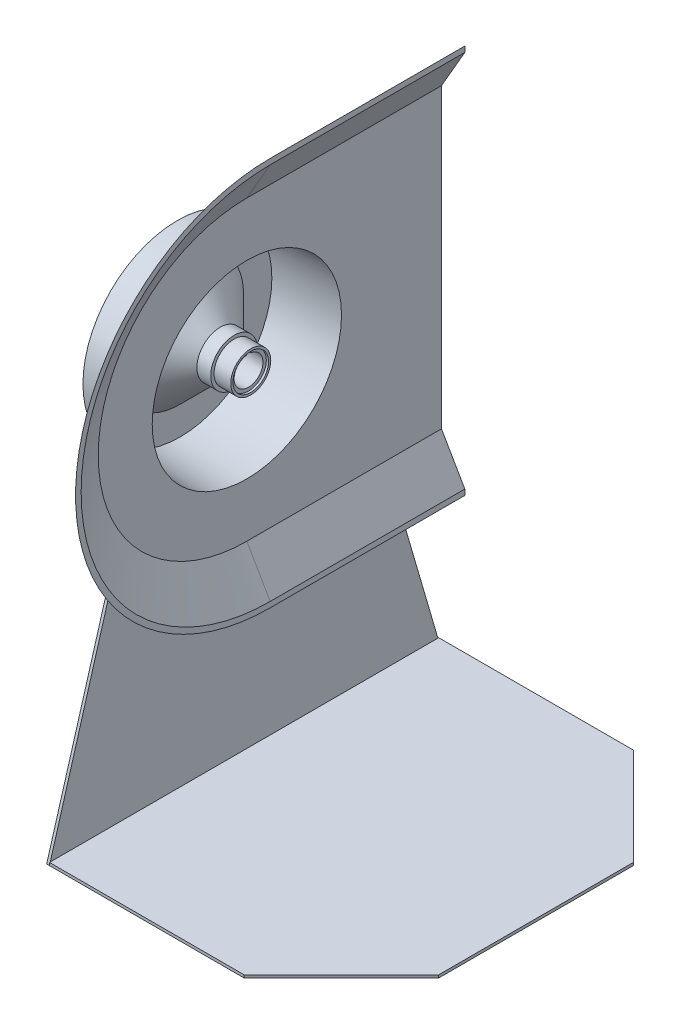
ISO-10303-21;
HEADER;
FILE_DESCRIPTION(('STEP AP214'),'2;1');
FILE_NAME('part.step','',(''),(''),'','','');
FILE_SCHEMA(('AUTOMOTIVE_DESIGN { 1 0 10303 214 1 1 1 1 }'));
ENDSEC;
DATA;
#1=APPLICATION_CONTEXT('core data for automotive mechanical design processes');
#2=APPLICATION_PROTOCOL_DEFINITION('international standard','automotive_design',2000,#1);
#3=PRODUCT_CONTEXT('',#1,'mechanical');
#4=PRODUCT('Part','Part','',(#3));
#5=PRODUCT_RELATED_PRODUCT_CATEGORY('part','',(#4));
#6=PRODUCT_DEFINITION_FORMATION('','',#4);
#7=PRODUCT_DEFINITION_CONTEXT('part definition',#1,'design');
#8=PRODUCT_DEFINITION('design','',#6,#7);
#9=PRODUCT_DEFINITION_SHAPE('','',#8);
#10=(LENGTH_UNIT() NAMED_UNIT(*) SI_UNIT(.MILLI.,.METRE.));
#11=(NAMED_UNIT(*) PLANE_ANGLE_UNIT() SI_UNIT($,.RADIAN.));
#12=(NAMED_UNIT(*) SI_UNIT($,.STERADIAN.) SOLID_ANGLE_UNIT());
#13=UNCERTAINTY_MEASURE_WITH_UNIT(LENGTH_MEASURE(1.E-05),#10,'distance_accuracy_value','');
#14=(GEOMETRIC_REPRESENTATION_CONTEXT(3) GLOBAL_UNCERTAINTY_ASSIGNED_CONTEXT((#13)) GLOBAL_UNIT_ASSIGNED_CONTEXT((#10,
#11,#12)) REPRESENTATION_CONTEXT('',''));
#15=CARTESIAN_POINT('',(0.,0.,0.));
#16=DIRECTION('',(0.,0.,1.));
#17=DIRECTION('',(1.,0.,0.));
#18=AXIS2_PLACEMENT_3D('',#15,#16,#17);
#19=CARTESIAN_POINT('',(-127.,0.,0.));
#20=DIRECTION('',(-1.,0.,0.));
#21=DIRECTION('',(0.,0.,1.));
#22=AXIS2_PLACEMENT_3D('',#19,#20,#21);
#23=PLANE('',#22);
#24=CARTESIAN_POINT('',(-127.,0.,0.));
#25=DIRECTION('',(-1.,0.,0.));
#26=DIRECTION('',(0.,0.,1.));
#27=AXIS2_PLACEMENT_3D('',#24,#25,#26);
#28=CIRCLE('',#27,31.);
#29=CARTESIAN_POINT('',(-127.,0.,31.));
#30=VERTEX_POINT('',#29);
#31=EDGE_CURVE('E293',#30,#30,#28,.T.);
#32=ORIENTED_EDGE('',*,*,#31,.T.);
#33=EDGE_LOOP('',(#32));
#34=FACE_BOUND('',#33,.T.);
#35=DIRECTION('',(0.,0.,1.));
#36=VECTOR('',#35,1.);
#37=CARTESIAN_POINT('',(-127.,30.,-4.00000000000003));
#38=LINE('',#37,#36);
#39=CARTESIAN_POINT('',(-127.,30.,-4.00000000000003));
#40=VERTEX_POINT('',#39);
#41=CARTESIAN_POINT('',(-127.,30.,3.99999999999997));
#42=VERTEX_POINT('',#41);
#43=EDGE_CURVE('E749',#40,#42,#38,.T.);
#44=ORIENTED_EDGE('',*,*,#43,.T.);
#45=DIRECTION('',(0.,-1.,0.));
#46=VECTOR('',#45,1.);
#47=CARTESIAN_POINT('',(-127.,26.,3.99999999999997));
#48=LINE('',#47,#46);
#49=CARTESIAN_POINT('',(-127.,25.6904651573303,3.99999999999997));
#50=VERTEX_POINT('',#49);
#51=EDGE_CURVE('E214',#42,#50,#48,.T.);
#52=ORIENTED_EDGE('',*,*,#51,.T.);
#53=CARTESIAN_POINT('',(-127.,0.,0.));
#54=DIRECTION('',(-1.,0.,0.));
#55=DIRECTION('',(0.,0.,1.));
#56=AXIS2_PLACEMENT_3D('',#53,#54,#55);
#57=CIRCLE('',#56,26.);
#58=CARTESIAN_POINT('',(-127.,25.6904651573303,-3.99999999999999));
#59=VERTEX_POINT('',#58);
#60=EDGE_CURVE('E221',#59,#50,#57,.T.);
#61=ORIENTED_EDGE('',*,*,#60,.F.);
#62=DIRECTION('',(0.,-1.,0.));
#63=VECTOR('',#62,1.);
#64=CARTESIAN_POINT('',(-127.,30.,-4.00000000000003));
#65=LINE('',#64,#63);
#66=EDGE_CURVE('E205',#40,#59,#65,.T.);
#67=ORIENTED_EDGE('',*,*,#66,.F.);
#68=EDGE_LOOP('',(#44,#52,#61,#67));
#69=FACE_BOUND('',#68,.T.);
#70=ADVANCED_FACE('F47',(#34,#69),#23,.T.);
#71=CARTESIAN_POINT('',(0.,0.,0.));
#72=DIRECTION('',(-1.,0.,0.));
#73=DIRECTION('',(0.,0.,1.));
#74=AXIS2_PLACEMENT_3D('',#71,#72,#73);
#75=CYLINDRICAL_SURFACE('',#74,26.);
#76=DIRECTION('',(-1.,0.,0.));
#77=VECTOR('',#76,1.);
#78=CARTESIAN_POINT('',(0.,25.6904651573303,3.99999999999997));
#79=LINE('',#78,#77);
#80=CARTESIAN_POINT('',(-39.,25.6904651573303,3.99999999999997));
#81=VERTEX_POINT('',#80);
#82=EDGE_CURVE('E225',#50,#81,#79,.F.);
#83=ORIENTED_EDGE('',*,*,#82,.T.);
#84=CARTESIAN_POINT('',(-39.,0.,0.));
#85=DIRECTION('',(1.,0.,0.));
#86=DIRECTION('',(0.,0.,-1.));
#87=AXIS2_PLACEMENT_3D('',#84,#85,#86);
#88=CIRCLE('',#87,26.);
#89=CARTESIAN_POINT('',(-39.,25.6904651573303,-3.99999999999999));
#90=VERTEX_POINT('',#89);
#91=EDGE_CURVE('E223',#81,#90,#88,.T.);
#92=ORIENTED_EDGE('',*,*,#91,.T.);
#93=DIRECTION('',(-1.,0.,0.));
#94=VECTOR('',#93,1.);
#95=CARTESIAN_POINT('',(0.,25.6904651573303,-3.99999999999999));
#96=LINE('',#95,#94);
#97=EDGE_CURVE('E208',#59,#90,#96,.F.);
#98=ORIENTED_EDGE('',*,*,#97,.F.);
#99=ORIENTED_EDGE('',*,*,#60,.T.);
#100=EDGE_LOOP('',(#83,#92,#98,#99));
#101=FACE_BOUND('',#100,.T.);
#102=ADVANCED_FACE('F220',(#101),#75,.F.);
#103=CARTESIAN_POINT('',(-39.,32.,0.));
#104=DIRECTION('',(1.,0.,0.));
#105=DIRECTION('',(0.,0.,-1.));
#106=AXIS2_PLACEMENT_3D('',#103,#104,#105);
#107=PLANE('',#106);
#108=CARTESIAN_POINT('',(-39.,0.,0.));
#109=DIRECTION('',(1.,0.,0.));
#110=DIRECTION('',(0.,0.,-1.));
#111=AXIS2_PLACEMENT_3D('',#108,#109,#110);
#112=CIRCLE('',#111,32.);
#113=CARTESIAN_POINT('',(-39.,0.,-32.));
#114=VERTEX_POINT('',#113);
#115=EDGE_CURVE('E431',#114,#114,#112,.T.);
#116=ORIENTED_EDGE('',*,*,#115,.T.);
#117=EDGE_LOOP('',(#116));
#118=FACE_BOUND('',#117,.T.);
#119=ORIENTED_EDGE('',*,*,#91,.F.);
#120=DIRECTION('',(0.,-1.,0.));
#121=VECTOR('',#120,1.);
#122=CARTESIAN_POINT('',(-39.,26.,3.99999999999997));
#123=LINE('',#122,#121);
#124=CARTESIAN_POINT('',(-39.,30.,3.99999999999997));
#125=VERTEX_POINT('',#124);
#126=EDGE_CURVE('E743',#125,#81,#123,.T.);
#127=ORIENTED_EDGE('',*,*,#126,.F.);
#128=DIRECTION('',(0.,0.,1.));
#129=VECTOR('',#128,1.);
#130=CARTESIAN_POINT('',(-39.,30.,-4.00000000000003));
#131=LINE('',#130,#129);
#132=CARTESIAN_POINT('',(-39.,30.,-4.00000000000003));
#133=VERTEX_POINT('',#132);
#134=EDGE_CURVE('E738',#133,#125,#131,.T.);
#135=ORIENTED_EDGE('',*,*,#134,.F.);
#136=DIRECTION('',(0.,-1.,0.));
#137=VECTOR('',#136,1.);
#138=CARTESIAN_POINT('',(-39.,30.,-4.00000000000003));
#139=LINE('',#138,#137);
#140=EDGE_CURVE('E746',#133,#90,#139,.T.);
#141=ORIENTED_EDGE('',*,*,#140,.T.);
#142=EDGE_LOOP('',(#119,#127,#135,#141));
#143=FACE_BOUND('',#142,.T.);
#144=ADVANCED_FACE('F477',(#118,#143),#107,.T.);
#145=CARTESIAN_POINT('',(-47.,-268.593612044262,-1.87557916837002E-12));
#146=DIRECTION('',(1.,0.,0.));
#147=DIRECTION('',(0.,0.,-1.));
#148=AXIS2_PLACEMENT_3D('',#145,#146,#147);
#149=PLANE('',#148);
#150=DIRECTION('',(0.,-0.96,-0.28));
#151=VECTOR('',#150,1.);
#152=CARTESIAN_POINT('',(-47.,0.,-175.));
#153=LINE('',#152,#151);
#154=CARTESIAN_POINT('',(-47.,0.,-175.));
#155=VERTEX_POINT('',#154);
#156=CARTESIAN_POINT('',(-47.,-268.59361204426,-253.339803512909));
#157=VERTEX_POINT('',#156);
#158=EDGE_CURVE('E391',#155,#157,#153,.T.);
#159=ORIENTED_EDGE('',*,*,#158,.F.);
#160=CARTESIAN_POINT('',(-47.,0.,0.));
#161=DIRECTION('',(-1.,0.,0.));
#162=DIRECTION('',(0.,0.,1.));
#163=AXIS2_PLACEMENT_3D('',#160,#161,#162);
#164=CIRCLE('',#163,175.);
#165=CARTESIAN_POINT('',(-47.,0.,175.));
#166=VERTEX_POINT('',#165);
#167=EDGE_CURVE('E11',#166,#155,#164,.T.);
#168=ORIENTED_EDGE('',*,*,#167,.F.);
#169=DIRECTION('',(0.,-0.96,0.28));
#170=VECTOR('',#169,1.);
#171=CARTESIAN_POINT('',(-47.,0.,175.));
#172=LINE('',#171,#170);
#173=CARTESIAN_POINT('',(-47.,-154.144780244417,219.958894237955));
#174=VERTEX_POINT('',#173);
#175=EDGE_CURVE('E370',#166,#174,#172,.T.);
#176=ORIENTED_EDGE('',*,*,#175,.T.);
#177=CARTESIAN_POINT('',(-47.,0.,0.));
#178=DIRECTION('',(-1.,0.,0.));
#179=DIRECTION('',(0.,0.,1.));
#180=AXIS2_PLACEMENT_3D('',#177,#178,#179);
#181=CIRCLE('',#180,268.593612044262);
#182=CARTESIAN_POINT('',(-47.,268.593612044262,1.87557916837002E-12));
#183=VERTEX_POINT('',#182);
#184=EDGE_CURVE('E349',#174,#183,#181,.T.);
#185=ORIENTED_EDGE('',*,*,#184,.T.);
#186=DIRECTION('',(0.,0.,1.));
#187=VECTOR('',#186,1.);
#188=CARTESIAN_POINT('',(-47.,268.593612044264,-349.999999999998));
#189=LINE('',#188,#187);
#190=CARTESIAN_POINT('',(-47.,268.593612044264,-349.999999999998));
#191=VERTEX_POINT('',#190);
#192=EDGE_CURVE('E326',#191,#183,#189,.T.);
#193=ORIENTED_EDGE('',*,*,#192,.F.);
#194=DIRECTION('',(0.,1.,0.));
#195=VECTOR('',#194,1.);
#196=CARTESIAN_POINT('',(-47.,268.593612044264,-349.999999999998));
#197=LINE('',#196,#195);
#198=CARTESIAN_POINT('',(-47.,-268.593612044259,-350.000000000002));
#199=VERTEX_POINT('',#198);
#200=EDGE_CURVE('E316',#199,#191,#197,.T.);
#201=ORIENTED_EDGE('',*,*,#200,.F.);
#202=DIRECTION('',(0.,0.,1.));
#203=VECTOR('',#202,1.);
#204=CARTESIAN_POINT('',(-47.,-268.593612044259,-350.000000000002));
#205=LINE('',#204,#203);
#206=EDGE_CURVE('E331',#199,#157,#205,.T.);
#207=ORIENTED_EDGE('',*,*,#206,.T.);
#208=EDGE_LOOP('',(#159,#168,#176,#185,#193,#201,#207));
#209=FACE_BOUND('',#208,.T.);
#210=ADVANCED_FACE('F365',(#209),#149,.F.);
#211=CARTESIAN_POINT('',(0.,2.44403693719019E-12,-350.));
#212=DIRECTION('',(0.,0.,1.));
#213=DIRECTION('',(0.,-1.,0.));
#214=AXIS2_PLACEMENT_3D('',#211,#212,#213);
#215=PLANE('',#214);
#216=DIRECTION('',(-0.499999999999995,0.866025403784442,0.));
#217=VECTOR('',#216,1.);
#218=CARTESIAN_POINT('',(-147.224318643353,-84.9999999999957,-350.000000000001));
#219=LINE('',#218,#217);
#220=CARTESIAN_POINT('',(0.,-339.999999999997,-350.000000000002));
#221=VERTEX_POINT('',#220);
#222=CARTESIAN_POINT('',(-42.,-267.253866082104,-350.000000000002));
#223=VERTEX_POINT('',#222);
#224=EDGE_CURVE('E238',#221,#223,#219,.T.);
#225=ORIENTED_EDGE('',*,*,#224,.F.);
#226=DIRECTION('',(0.,-1.,0.));
#227=VECTOR('',#226,1.);
#228=CARTESIAN_POINT('',(0.,-349.999999999998,-350.000000000002));
#229=LINE('',#228,#227);
#230=CARTESIAN_POINT('',(0.,-349.999999999998,-350.000000000002));
#231=VERTEX_POINT('',#230);
#232=EDGE_CURVE('E308',#221,#231,#229,.T.);
#233=ORIENTED_EDGE('',*,*,#232,.T.);
#234=DIRECTION('',(-0.499999999999995,0.866025403784442,0.));
#235=VECTOR('',#234,1.);
#236=CARTESIAN_POINT('',(-47.,-268.593612044259,-350.000000000002));
#237=LINE('',#236,#235);
#238=EDGE_CURVE('E313',#231,#199,#237,.T.);
#239=ORIENTED_EDGE('',*,*,#238,.T.);
#240=ORIENTED_EDGE('',*,*,#200,.T.);
#241=DIRECTION('',(0.499999999999995,0.866025403784442,0.));
#242=VECTOR('',#241,1.);
#243=CARTESIAN_POINT('',(0.,350.000000000002,-349.999999999998));
#244=LINE('',#243,#242);
#245=CARTESIAN_POINT('',(0.,350.000000000002,-349.999999999998));
#246=VERTEX_POINT('',#245);
#247=EDGE_CURVE('E319',#191,#246,#244,.T.);
#248=ORIENTED_EDGE('',*,*,#247,.T.);
#249=CARTESIAN_POINT('',(0.,340.000000000002,-349.999999999998));
#250=VERTEX_POINT('',#249);
#251=EDGE_CURVE('E309',#246,#250,#229,.T.);
#252=ORIENTED_EDGE('',*,*,#251,.T.);
#253=DIRECTION('',(0.499999999999995,0.866025403784442,0.));
#254=VECTOR('',#253,1.);
#255=CARTESIAN_POINT('',(-147.224318643353,85.0000000000006,-349.999999999999));
#256=LINE('',#255,#254);
#257=CARTESIAN_POINT('',(-42.,267.253866082108,-349.999999999998));
#258=VERTEX_POINT('',#257);
#259=EDGE_CURVE('E287',#258,#250,#256,.T.);
#260=ORIENTED_EDGE('',*,*,#259,.F.);
#261=DIRECTION('',(0.,1.,0.));
#262=VECTOR('',#261,1.);
#263=CARTESIAN_POINT('',(-42.,2.44403693719019E-12,-350.));
#264=LINE('',#263,#262);
#265=EDGE_CURVE('E283',#223,#258,#264,.T.);
#266=ORIENTED_EDGE('',*,*,#265,.F.);
#267=EDGE_LOOP('',(#225,#233,#239,#240,#248,#252,#260,#266));
#268=FACE_BOUND('',#267,.T.);
#269=ADVANCED_FACE('F386',(#268),#215,.F.);
#270=CARTESIAN_POINT('',(0.,0.,0.));
#271=DIRECTION('',(1.,0.,0.));
#272=DIRECTION('',(0.,0.,-1.));
#273=AXIS2_PLACEMENT_3D('',#270,#271,#272);
#274=CONICAL_SURFACE('',#273,350.,1.0471975511966);
#275=CARTESIAN_POINT('',(0.,0.,0.));
#276=DIRECTION('',(-1.,0.,0.));
#277=DIRECTION('',(0.,0.,1.));
#278=AXIS2_PLACEMENT_3D('',#275,#276,#277);
#279=CIRCLE('',#278,350.);
#280=CARTESIAN_POINT('',(0.,-350.,-2.44403693719019E-12));
#281=VERTEX_POINT('',#280);
#282=CARTESIAN_POINT('',(0.,350.,2.44403693719019E-12));
#283=VERTEX_POINT('',#282);
#284=EDGE_CURVE('E51',#281,#283,#279,.T.);
#285=ORIENTED_EDGE('',*,*,#284,.T.);
#286=DIRECTION('',(-0.499999999999995,-0.866025403784442,0.));
#287=VECTOR('',#286,1.);
#288=CARTESIAN_POINT('',(-47.,268.593612044262,0.));
#289=LINE('',#288,#287);
#290=EDGE_CURVE('E342',#283,#183,#289,.T.);
#291=ORIENTED_EDGE('',*,*,#290,.T.);
#292=ORIENTED_EDGE('',*,*,#184,.F.);
#293=CARTESIAN_POINT('',(-47.,-268.593612044262,-1.83186799063151E-12));
#294=VERTEX_POINT('',#293);
#295=EDGE_CURVE('E350',#294,#174,#181,.T.);
#296=ORIENTED_EDGE('',*,*,#295,.F.);
#297=DIRECTION('',(-0.499999999999995,0.866025403784442,0.));
#298=VECTOR('',#297,1.);
#299=CARTESIAN_POINT('',(-47.,-268.593612044262,-1.87557916837002E-12));
#300=LINE('',#299,#298);
#301=EDGE_CURVE('E346',#281,#294,#300,.T.);
#302=ORIENTED_EDGE('',*,*,#301,.F.);
#303=EDGE_LOOP('',(#285,#291,#292,#296,#302));
#304=FACE_BOUND('',#303,.T.);
#305=ADVANCED_FACE('F375',(#304),#274,.T.);
#306=CARTESIAN_POINT('',(0.,-350.,-2.44403693719019E-12));
#307=DIRECTION('',(-1.,0.,0.));
#308=DIRECTION('',(0.,0.,1.));
#309=AXIS2_PLACEMENT_3D('',#306,#307,#308);
#310=PLANE('',#309);
#311=ORIENTED_EDGE('',*,*,#232,.F.);
#312=DIRECTION('',(0.,0.,1.));
#313=VECTOR('',#312,1.);
#314=CARTESIAN_POINT('',(0.,-339.999999999997,-350.000000000002));
#315=LINE('',#314,#313);
#316=CARTESIAN_POINT('',(0.,-340.,-2.44249065417534E-12));
#317=VERTEX_POINT('',#316);
#318=EDGE_CURVE('E267',#221,#317,#315,.T.);
#319=ORIENTED_EDGE('',*,*,#318,.T.);
#320=CARTESIAN_POINT('',(0.,0.,0.));
#321=DIRECTION('',(-1.,0.,0.));
#322=DIRECTION('',(0.,0.,1.));
#323=AXIS2_PLACEMENT_3D('',#320,#321,#322);
#324=CIRCLE('',#323,340.);
#325=CARTESIAN_POINT('',(0.,340.,0.));
#326=VERTEX_POINT('',#325);
#327=EDGE_CURVE('E255',#317,#326,#324,.T.);
#328=ORIENTED_EDGE('',*,*,#327,.T.);
#329=DIRECTION('',(0.,0.,1.));
#330=VECTOR('',#329,1.);
#331=CARTESIAN_POINT('',(0.,340.,2.37420731041333E-12));
#332=LINE('',#331,#330);
#333=EDGE_CURVE('E271',#250,#326,#332,.T.);
#334=ORIENTED_EDGE('',*,*,#333,.F.);
#335=ORIENTED_EDGE('',*,*,#251,.F.);
#336=DIRECTION('',(0.,0.,1.));
#337=VECTOR('',#336,1.);
#338=CARTESIAN_POINT('',(0.,350.000000000002,-349.999999999998));
#339=LINE('',#338,#337);
#340=EDGE_CURVE('E322',#246,#283,#339,.T.);
#341=ORIENTED_EDGE('',*,*,#340,.T.);
#342=ORIENTED_EDGE('',*,*,#284,.F.);
#343=DIRECTION('',(0.,0.,1.));
#344=VECTOR('',#343,1.);
#345=CARTESIAN_POINT('',(0.,-349.999999999998,-350.000000000002));
#346=LINE('',#345,#344);
#347=EDGE_CURVE('E335',#231,#281,#346,.T.);
#348=ORIENTED_EDGE('',*,*,#347,.F.);
#349=EDGE_LOOP('',(#311,#319,#328,#334,#335,#341,#342,#348));
#350=FACE_BOUND('',#349,.T.);
#351=ADVANCED_FACE('F49',(#350),#310,.F.);
#352=CARTESIAN_POINT('',(-47.,0.,0.));
#353=DIRECTION('',(1.,0.,0.));
#354=DIRECTION('',(0.,0.,1.));
#355=AXIS2_PLACEMENT_3D('',#352,#353,#354);
#356=CONICAL_SURFACE('',#355,175.,0.0436332312998583);
#357=CARTESIAN_POINT('',(-167.,0.,0.));
#358=DIRECTION('',(-1.,0.,0.));
#359=DIRECTION('',(0.,0.,1.));
#360=AXIS2_PLACEMENT_3D('',#357,#358,#359);
#361=CIRCLE('',#360,169.760686850979);
#362=CARTESIAN_POINT('',(-167.,0.,169.760686850979));
#363=VERTEX_POINT('',#362);
#364=EDGE_CURVE('E337',#363,#363,#361,.T.);
#365=ORIENTED_EDGE('',*,*,#364,.F.);
#366=EDGE_LOOP('',(#365));
#367=FACE_BOUND('',#366,.T.);
#368=ORIENTED_EDGE('',*,*,#167,.T.);
#369=CARTESIAN_POINT('',(-47.,0.,0.));
#370=DIRECTION('',(-1.,0.,0.));
#371=DIRECTION('',(0.,0.,1.));
#372=AXIS2_PLACEMENT_3D('',#369,#370,#371);
#373=CIRCLE('',#372,175.);
#374=EDGE_CURVE('E826',#155,#166,#373,.T.);
#375=ORIENTED_EDGE('',*,*,#374,.T.);
#376=EDGE_LOOP('',(#368,#375));
#377=FACE_BOUND('',#376,.T.);
#378=ADVANCED_FACE('F503',(#367,#377),#356,.T.);
#379=CARTESIAN_POINT('',(-167.,0.,0.));
#380=DIRECTION('',(-1.,0.,0.));
#381=DIRECTION('',(0.,0.,1.));
#382=AXIS2_PLACEMENT_3D('',#379,#380,#381);
#383=PLANE('',#382);
#384=CARTESIAN_POINT('',(-167.,0.,0.));
#385=DIRECTION('',(-1.,0.,0.));
#386=DIRECTION('',(0.,0.,1.));
#387=AXIS2_PLACEMENT_3D('',#384,#385,#386);
#388=CIRCLE('',#387,112.);
#389=CARTESIAN_POINT('',(-167.,0.,112.));
#390=VERTEX_POINT('',#389);
#391=EDGE_CURVE('E297',#390,#390,#388,.T.);
#392=ORIENTED_EDGE('',*,*,#391,.F.);
#393=EDGE_LOOP('',(#392));
#394=FACE_BOUND('',#393,.T.);
#395=ORIENTED_EDGE('',*,*,#364,.T.);
#396=EDGE_LOOP('',(#395));
#397=FACE_BOUND('',#396,.T.);
#398=ADVANCED_FACE('F500',(#394,#397),#383,.T.);
#399=CARTESIAN_POINT('',(-47.,-268.593612044259,-350.000000000002));
#400=DIRECTION('',(0.866025403784442,0.499999999999995,0.));
#401=DIRECTION('',(-0.499999999999995,0.866025403784442,0.));
#402=AXIS2_PLACEMENT_3D('',#399,#400,#401);
#403=PLANE('',#402);
#404=ORIENTED_EDGE('',*,*,#301,.T.);
#405=EDGE_CURVE('E330',#157,#294,#205,.T.);
#406=ORIENTED_EDGE('',*,*,#405,.F.);
#407=ORIENTED_EDGE('',*,*,#206,.F.);
#408=ORIENTED_EDGE('',*,*,#238,.F.);
#409=ORIENTED_EDGE('',*,*,#347,.T.);
#410=EDGE_LOOP('',(#404,#406,#407,#408,#409));
#411=FACE_BOUND('',#410,.T.);
#412=ADVANCED_FACE('F497',(#411),#403,.F.);
#413=CARTESIAN_POINT('',(0.,350.000000000002,-349.999999999998));
#414=DIRECTION('',(0.866025403784442,-0.499999999999995,0.));
#415=DIRECTION('',(0.499999999999995,0.866025403784442,0.));
#416=AXIS2_PLACEMENT_3D('',#413,#414,#415);
#417=PLANE('',#416);
#418=ORIENTED_EDGE('',*,*,#290,.F.);
#419=ORIENTED_EDGE('',*,*,#340,.F.);
#420=ORIENTED_EDGE('',*,*,#247,.F.);
#421=ORIENTED_EDGE('',*,*,#192,.T.);
#422=EDGE_LOOP('',(#418,#419,#420,#421));
#423=FACE_BOUND('',#422,.T.);
#424=ADVANCED_FACE('F373',(#423),#417,.F.);
#425=CARTESIAN_POINT('',(-167.,0.,0.));
#426=DIRECTION('',(-1.,0.,0.));
#427=DIRECTION('',(0.,0.,1.));
#428=AXIS2_PLACEMENT_3D('',#425,#426,#427);
#429=CONICAL_SURFACE('',#428,112.,0.78539816339745);
#430=CARTESIAN_POINT('',(-135.,0.,0.));
#431=DIRECTION('',(-1.,0.,0.));
#432=DIRECTION('',(0.,0.,1.));
#433=AXIS2_PLACEMENT_3D('',#430,#431,#432);
#434=CIRCLE('',#433,79.9999999999999);
#435=CARTESIAN_POINT('',(-135.,0.,79.9999999999999));
#436=VERTEX_POINT('',#435);
#437=EDGE_CURVE('E304',#436,#436,#434,.T.);
#438=ORIENTED_EDGE('',*,*,#437,.F.);
#439=EDGE_LOOP('',(#438));
#440=FACE_BOUND('',#439,.T.);
#441=ORIENTED_EDGE('',*,*,#391,.T.);
#442=EDGE_LOOP('',(#441));
#443=FACE_BOUND('',#442,.T.);
#444=ADVANCED_FACE('F488',(#440,#443),#429,.F.);
#445=CARTESIAN_POINT('',(-135.,0.,0.));
#446=DIRECTION('',(-1.,0.,0.));
#447=DIRECTION('',(0.,0.,1.));
#448=AXIS2_PLACEMENT_3D('',#445,#446,#447);
#449=PLANE('',#448);
#450=CARTESIAN_POINT('',(-135.,0.,0.));
#451=DIRECTION('',(-1.,0.,0.));
#452=DIRECTION('',(0.,0.,1.));
#453=AXIS2_PLACEMENT_3D('',#450,#451,#452);
#454=CIRCLE('',#453,31.);
#455=CARTESIAN_POINT('',(-135.,0.,31.));
#456=VERTEX_POINT('',#455);
#457=EDGE_CURVE('E262',#456,#456,#454,.T.);
#458=ORIENTED_EDGE('',*,*,#457,.F.);
#459=EDGE_LOOP('',(#458));
#460=FACE_BOUND('',#459,.T.);
#461=ORIENTED_EDGE('',*,*,#437,.T.);
#462=EDGE_LOOP('',(#461));
#463=FACE_BOUND('',#462,.T.);
#464=ADVANCED_FACE('F484',(#460,#463),#449,.T.);
#465=CARTESIAN_POINT('',(-127.,0.,0.));
#466=DIRECTION('',(-1.,0.,0.));
#467=DIRECTION('',(0.,0.,1.));
#468=AXIS2_PLACEMENT_3D('',#465,#466,#467);
#469=CYLINDRICAL_SURFACE('',#468,31.);
#470=ORIENTED_EDGE('',*,*,#31,.F.);
#471=EDGE_LOOP('',(#470));
#472=FACE_BOUND('',#471,.T.);
#473=ORIENTED_EDGE('',*,*,#457,.T.);
#474=EDGE_LOOP('',(#473));
#475=FACE_BOUND('',#474,.T.);
#476=ADVANCED_FACE('F480',(#472,#475),#469,.F.);
#477=CARTESIAN_POINT('',(4.33012701892221,0.,0.));
#478=DIRECTION('',(1.,0.,0.));
#479=DIRECTION('',(0.,0.,-1.));
#480=AXIS2_PLACEMENT_3D('',#477,#478,#479);
#481=CONICAL_SURFACE('',#480,347.5,1.0471975511966);
#482=ORIENTED_EDGE('',*,*,#327,.F.);
#483=DIRECTION('',(-0.499999999999995,0.866025403784442,0.));
#484=VECTOR('',#483,1.);
#485=CARTESIAN_POINT('',(-42.6698729810789,-266.09361204426,-2.44249065417534E-12));
#486=LINE('',#485,#484);
#487=CARTESIAN_POINT('',(-42.,-267.253866082106,-2.44249065417534E-12));
#488=VERTEX_POINT('',#487);
#489=EDGE_CURVE('E249',#317,#488,#486,.T.);
#490=ORIENTED_EDGE('',*,*,#489,.T.);
#491=CARTESIAN_POINT('',(-42.,0.,0.));
#492=DIRECTION('',(1.,0.,0.));
#493=DIRECTION('',(0.,0.,-1.));
#494=AXIS2_PLACEMENT_3D('',#491,#492,#493);
#495=CIRCLE('',#494,267.253866082106);
#496=CARTESIAN_POINT('',(-42.,267.253866082106,0.));
#497=VERTEX_POINT('',#496);
#498=EDGE_CURVE('E251',#488,#497,#495,.F.);
#499=ORIENTED_EDGE('',*,*,#498,.T.);
#500=DIRECTION('',(0.499999999999995,0.866025403784442,0.));
#501=VECTOR('',#500,1.);
#502=CARTESIAN_POINT('',(4.33012701892221,347.5,0.));
#503=LINE('',#502,#501);
#504=EDGE_CURVE('E245',#326,#497,#503,.F.);
#505=ORIENTED_EDGE('',*,*,#504,.F.);
#506=EDGE_LOOP('',(#482,#490,#499,#505));
#507=FACE_BOUND('',#506,.T.);
#508=ADVANCED_FACE('F483',(#507),#481,.F.);
#509=CARTESIAN_POINT('',(-42.,-268.593612044262,-1.87557916837002E-12));
#510=DIRECTION('',(1.,0.,0.));
#511=DIRECTION('',(0.,0.,-1.));
#512=AXIS2_PLACEMENT_3D('',#509,#510,#511);
#513=PLANE('',#512);
#514=CARTESIAN_POINT('',(-42.,0.,0.));
#515=DIRECTION('',(1.,0.,0.));
#516=DIRECTION('',(0.,0.,-1.));
#517=AXIS2_PLACEMENT_3D('',#514,#515,#516);
#518=CIRCLE('',#517,170.213541288726);
#519=CARTESIAN_POINT('',(-42.,0.,-170.213541288726));
#520=VERTEX_POINT('',#519);
#521=EDGE_CURVE('E258',#520,#520,#518,.F.);
#522=ORIENTED_EDGE('',*,*,#521,.T.);
#523=EDGE_LOOP('',(#522));
#524=FACE_BOUND('',#523,.T.);
#525=DIRECTION('',(0.,0.,1.));
#526=VECTOR('',#525,1.);
#527=CARTESIAN_POINT('',(-42.,-267.253866082106,-1.86622377231871E-12));
#528=LINE('',#527,#526);
#529=EDGE_CURVE('E263',#223,#488,#528,.T.);
#530=ORIENTED_EDGE('',*,*,#529,.F.);
#531=ORIENTED_EDGE('',*,*,#265,.T.);
#532=DIRECTION('',(0.,0.,1.));
#533=VECTOR('',#532,1.);
#534=CARTESIAN_POINT('',(-42.,267.253866082108,-349.999999999998));
#535=LINE('',#534,#533);
#536=EDGE_CURVE('E268',#258,#497,#535,.T.);
#537=ORIENTED_EDGE('',*,*,#536,.T.);
#538=ORIENTED_EDGE('',*,*,#498,.F.);
#539=EDGE_LOOP('',(#530,#531,#537,#538));
#540=FACE_BOUND('',#539,.T.);
#541=ADVANCED_FACE('F1040',(#524,#540),#513,.T.);
#542=CARTESIAN_POINT('',(-46.7819030631733,0.,0.));
#543=DIRECTION('',(1.,0.,0.));
#544=DIRECTION('',(0.,0.,1.));
#545=AXIS2_PLACEMENT_3D('',#542,#543,#544);
#546=CONICAL_SURFACE('',#545,170.004758892091,0.0436332312998583);
#547=CARTESIAN_POINT('',(-162.,0.,0.));
#548=DIRECTION('',(-1.,0.,0.));
#549=DIRECTION('',(0.,0.,1.));
#550=AXIS2_PLACEMENT_3D('',#547,#548,#549);
#551=CIRCLE('',#550,164.974228139705);
#552=CARTESIAN_POINT('',(-162.,0.,164.974228139705));
#553=VERTEX_POINT('',#552);
#554=EDGE_CURVE('E250',#553,#553,#551,.T.);
#555=ORIENTED_EDGE('',*,*,#554,.T.);
#556=EDGE_LOOP('',(#555));
#557=FACE_BOUND('',#556,.T.);
#558=ORIENTED_EDGE('',*,*,#521,.F.);
#559=EDGE_LOOP('',(#558));
#560=FACE_BOUND('',#559,.T.);
#561=ADVANCED_FACE('F1042',(#557,#560),#546,.F.);
#562=CARTESIAN_POINT('',(-162.,0.,0.));
#563=DIRECTION('',(-1.,0.,0.));
#564=DIRECTION('',(0.,0.,1.));
#565=AXIS2_PLACEMENT_3D('',#562,#563,#564);
#566=PLANE('',#565);
#567=CARTESIAN_POINT('',(-162.,0.,0.));
#568=DIRECTION('',(-1.,0.,0.));
#569=DIRECTION('',(0.,0.,1.));
#570=AXIS2_PLACEMENT_3D('',#567,#568,#569);
#571=CIRCLE('',#570,114.071067811865);
#572=CARTESIAN_POINT('',(-162.,0.,114.071067811865));
#573=VERTEX_POINT('',#572);
#574=EDGE_CURVE('E230',#573,#573,#571,.T.);
#575=ORIENTED_EDGE('',*,*,#574,.T.);
#576=EDGE_LOOP('',(#575));
#577=FACE_BOUND('',#576,.T.);
#578=ORIENTED_EDGE('',*,*,#554,.F.);
#579=EDGE_LOOP('',(#578));
#580=FACE_BOUND('',#579,.T.);
#581=ADVANCED_FACE('F1049',(#577,#580),#566,.F.);
#582=CARTESIAN_POINT('',(-42.6698729810778,-266.093612044259,-350.000000000002));
#583=DIRECTION('',(0.866025403784442,0.499999999999995,0.));
#584=DIRECTION('',(-0.499999999999995,0.866025403784442,0.));
#585=AXIS2_PLACEMENT_3D('',#582,#583,#584);
#586=PLANE('',#585);
#587=ORIENTED_EDGE('',*,*,#489,.F.);
#588=ORIENTED_EDGE('',*,*,#318,.F.);
#589=ORIENTED_EDGE('',*,*,#224,.T.);
#590=ORIENTED_EDGE('',*,*,#529,.T.);
#591=EDGE_LOOP('',(#587,#588,#589,#590));
#592=FACE_BOUND('',#591,.T.);
#593=ADVANCED_FACE('F1034',(#592),#586,.T.);
#594=CARTESIAN_POINT('',(4.33012701892221,347.500000000003,-349.999999999998));
#595=DIRECTION('',(0.866025403784442,-0.499999999999995,0.));
#596=DIRECTION('',(0.499999999999995,0.866025403784442,0.));
#597=AXIS2_PLACEMENT_3D('',#594,#595,#596);
#598=PLANE('',#597);
#599=ORIENTED_EDGE('',*,*,#504,.T.);
#600=ORIENTED_EDGE('',*,*,#536,.F.);
#601=ORIENTED_EDGE('',*,*,#259,.T.);
#602=ORIENTED_EDGE('',*,*,#333,.T.);
#603=EDGE_LOOP('',(#599,#600,#601,#602));
#604=FACE_BOUND('',#603,.T.);
#605=ADVANCED_FACE('F466',(#604),#598,.T.);
#606=CARTESIAN_POINT('',(-163.464466094067,0.,0.));
#607=DIRECTION('',(-1.,0.,0.));
#608=DIRECTION('',(0.,0.,1.));
#609=AXIS2_PLACEMENT_3D('',#606,#607,#608);
#610=CONICAL_SURFACE('',#609,115.535533905933,0.78539816339745);
#611=ORIENTED_EDGE('',*,*,#574,.F.);
#612=EDGE_LOOP('',(#611));
#613=FACE_BOUND('',#612,.T.);
#614=CARTESIAN_POINT('',(-89.9289321881346,0.,0.));
#615=DIRECTION('',(1.,0.,0.));
#616=DIRECTION('',(0.,0.,-1.));
#617=AXIS2_PLACEMENT_3D('',#614,#615,#616);
#618=CIRCLE('',#617,42.);
#619=CARTESIAN_POINT('',(-89.9289321881346,0.,-42.));
#620=VERTEX_POINT('',#619);
#621=EDGE_CURVE('E231',#620,#620,#618,.T.);
#622=ORIENTED_EDGE('',*,*,#621,.F.);
#623=EDGE_LOOP('',(#622));
#624=FACE_BOUND('',#623,.T.);
#625=ADVANCED_FACE('F457',(#613,#624),#610,.T.);
#626=CARTESIAN_POINT('',(0.,0.,0.));
#627=DIRECTION('',(1.,0.,0.));
#628=DIRECTION('',(0.,0.,-1.));
#629=AXIS2_PLACEMENT_3D('',#626,#627,#628);
#630=CYLINDRICAL_SURFACE('',#629,42.);
#631=ORIENTED_EDGE('',*,*,#621,.T.);
#632=EDGE_LOOP('',(#631));
#633=FACE_BOUND('',#632,.T.);
#634=CARTESIAN_POINT('',(-65.,0.,0.));
#635=DIRECTION('',(1.,0.,0.));
#636=DIRECTION('',(0.,0.,-1.));
#637=AXIS2_PLACEMENT_3D('',#634,#635,#636);
#638=CIRCLE('',#637,42.);
#639=CARTESIAN_POINT('',(-65.,0.,-42.));
#640=VERTEX_POINT('',#639);
#641=EDGE_CURVE('E241',#640,#640,#638,.T.);
#642=ORIENTED_EDGE('',*,*,#641,.F.);
#643=EDGE_LOOP('',(#642));
#644=FACE_BOUND('',#643,.T.);
#645=ADVANCED_FACE('F455',(#633,#644),#630,.T.);
#646=CARTESIAN_POINT('',(-65.,42.,0.));
#647=DIRECTION('',(1.,0.,0.));
#648=DIRECTION('',(0.,0.,-1.));
#649=AXIS2_PLACEMENT_3D('',#646,#647,#648);
#650=PLANE('',#649);
#651=ORIENTED_EDGE('',*,*,#641,.T.);
#652=EDGE_LOOP('',(#651));
#653=FACE_BOUND('',#652,.T.);
#654=CARTESIAN_POINT('',(-65.,0.,0.));
#655=DIRECTION('',(1.,0.,0.));
#656=DIRECTION('',(0.,0.,-1.));
#657=AXIS2_PLACEMENT_3D('',#654,#655,#656);
#658=CIRCLE('',#657,36.);
#659=CARTESIAN_POINT('',(-65.,0.,-36.));
#660=VERTEX_POINT('',#659);
#661=EDGE_CURVE('E443',#660,#660,#658,.T.);
#662=ORIENTED_EDGE('',*,*,#661,.F.);
#663=EDGE_LOOP('',(#662));
#664=FACE_BOUND('',#663,.T.);
#665=ADVANCED_FACE('F452',(#653,#664),#650,.T.);
#666=CARTESIAN_POINT('',(0.,0.,0.));
#667=DIRECTION('',(1.,0.,0.));
#668=DIRECTION('',(0.,0.,-1.));
#669=AXIS2_PLACEMENT_3D('',#666,#667,#668);
#670=CYLINDRICAL_SURFACE('',#669,36.);
#671=ORIENTED_EDGE('',*,*,#661,.T.);
#672=EDGE_LOOP('',(#671));
#673=FACE_BOUND('',#672,.T.);
#674=CARTESIAN_POINT('',(-35.,0.,0.));
#675=DIRECTION('',(1.,0.,0.));
#676=DIRECTION('',(0.,0.,-1.));
#677=AXIS2_PLACEMENT_3D('',#674,#675,#676);
#678=CIRCLE('',#677,36.);
#679=CARTESIAN_POINT('',(-35.,0.,-36.));
#680=VERTEX_POINT('',#679);
#681=EDGE_CURVE('E439',#680,#680,#678,.T.);
#682=ORIENTED_EDGE('',*,*,#681,.F.);
#683=EDGE_LOOP('',(#682));
#684=FACE_BOUND('',#683,.T.);
#685=ADVANCED_FACE('F464',(#673,#684),#670,.T.);
#686=CARTESIAN_POINT('',(-35.,36.,0.));
#687=DIRECTION('',(1.,0.,0.));
#688=DIRECTION('',(0.,0.,-1.));
#689=AXIS2_PLACEMENT_3D('',#686,#687,#688);
#690=PLANE('',#689);
#691=ORIENTED_EDGE('',*,*,#681,.T.);
#692=EDGE_LOOP('',(#691));
#693=FACE_BOUND('',#692,.T.);
#694=CARTESIAN_POINT('',(-35.,0.,0.));
#695=DIRECTION('',(1.,0.,0.));
#696=DIRECTION('',(0.,0.,-1.));
#697=AXIS2_PLACEMENT_3D('',#694,#695,#696);
#698=CIRCLE('',#697,32.);
#699=CARTESIAN_POINT('',(-35.,0.,-32.));
#700=VERTEX_POINT('',#699);
#701=EDGE_CURVE('E435',#700,#700,#698,.T.);
#702=ORIENTED_EDGE('',*,*,#701,.F.);
#703=EDGE_LOOP('',(#702));
#704=FACE_BOUND('',#703,.T.);
#705=ADVANCED_FACE('F526',(#693,#704),#690,.T.);
#706=CARTESIAN_POINT('',(0.,0.,0.));
#707=DIRECTION('',(1.,0.,0.));
#708=DIRECTION('',(0.,0.,-1.));
#709=AXIS2_PLACEMENT_3D('',#706,#707,#708);
#710=CYLINDRICAL_SURFACE('',#709,32.);
#711=ORIENTED_EDGE('',*,*,#701,.T.);
#712=EDGE_LOOP('',(#711));
#713=FACE_BOUND('',#712,.T.);
#714=ORIENTED_EDGE('',*,*,#115,.F.);
#715=EDGE_LOOP('',(#714));
#716=FACE_BOUND('',#715,.T.);
#717=ADVANCED_FACE('F524',(#713,#716),#710,.F.);
#718=CARTESIAN_POINT('',(-47.,0.,0.));
#719=DIRECTION('',(-1.,0.,0.));
#720=DIRECTION('',(0.,0.,1.));
#721=AXIS2_PLACEMENT_3D('',#718,#719,#720);
#722=PLANE('',#721);
#723=CARTESIAN_POINT('',(-47.,-595.,348.541666666666));
#724=VERTEX_POINT('',#723);
#725=EDGE_CURVE('E842',#174,#724,#172,.T.);
#726=ORIENTED_EDGE('',*,*,#725,.T.);
#727=DIRECTION('',(0.,0.,-1.));
#728=VECTOR('',#727,1.);
#729=CARTESIAN_POINT('',(-47.,-595.,350.));
#730=LINE('',#729,#728);
#731=CARTESIAN_POINT('',(-47.,-595.,-348.541666666667));
#732=VERTEX_POINT('',#731);
#733=EDGE_CURVE('E72',#724,#732,#730,.T.);
#734=ORIENTED_EDGE('',*,*,#733,.T.);
#735=EDGE_CURVE('E393',#157,#732,#153,.T.);
#736=ORIENTED_EDGE('',*,*,#735,.F.);
#737=ORIENTED_EDGE('',*,*,#405,.T.);
#738=ORIENTED_EDGE('',*,*,#295,.T.);
#739=EDGE_LOOP('',(#726,#734,#736,#737,#738));
#740=FACE_BOUND('',#739,.T.);
#741=ADVANCED_FACE('F394',(#740),#722,.F.);
#742=CARTESIAN_POINT('',(-52.,0.,0.));
#743=DIRECTION('',(1.,0.,0.));
#744=DIRECTION('',(0.,0.,-1.));
#745=AXIS2_PLACEMENT_3D('',#742,#743,#744);
#746=CYLINDRICAL_SURFACE('',#745,175.);
#747=ORIENTED_EDGE('',*,*,#374,.F.);
#748=DIRECTION('',(1.,0.,0.));
#749=VECTOR('',#748,1.);
#750=CARTESIAN_POINT('',(-52.,0.,-175.));
#751=LINE('',#750,#749);
#752=CARTESIAN_POINT('',(-52.,0.,-175.));
#753=VERTEX_POINT('',#752);
#754=EDGE_CURVE('E402',#753,#155,#751,.T.);
#755=ORIENTED_EDGE('',*,*,#754,.F.);
#756=CARTESIAN_POINT('',(-52.,0.,0.));
#757=DIRECTION('',(-1.,0.,0.));
#758=DIRECTION('',(0.,0.,1.));
#759=AXIS2_PLACEMENT_3D('',#756,#757,#758);
#760=CIRCLE('',#759,175.);
#761=CARTESIAN_POINT('',(-52.,0.,175.));
#762=VERTEX_POINT('',#761);
#763=EDGE_CURVE('E405',#753,#762,#760,.T.);
#764=ORIENTED_EDGE('',*,*,#763,.T.);
#765=DIRECTION('',(1.,0.,0.));
#766=VECTOR('',#765,1.);
#767=CARTESIAN_POINT('',(-52.,0.,175.));
#768=LINE('',#767,#766);
#769=EDGE_CURVE('E424',#762,#166,#768,.T.);
#770=ORIENTED_EDGE('',*,*,#769,.T.);
#771=EDGE_LOOP('',(#747,#755,#764,#770));
#772=FACE_BOUND('',#771,.T.);
#773=ADVANCED_FACE('F522',(#772),#746,.F.);
#774=CARTESIAN_POINT('',(-52.,0.,-175.));
#775=DIRECTION('',(0.,-0.28,0.96));
#776=DIRECTION('',(0.,-0.96,-0.28));
#777=AXIS2_PLACEMENT_3D('',#774,#775,#776);
#778=PLANE('',#777);
#779=ORIENTED_EDGE('',*,*,#158,.T.);
#780=ORIENTED_EDGE('',*,*,#735,.T.);
#781=DIRECTION('',(0.,-0.96,-0.28));
#782=VECTOR('',#781,1.);
#783=CARTESIAN_POINT('',(-47.,0.,-175.));
#784=LINE('',#783,#782);
#785=CARTESIAN_POINT('',(-47.,-600.,-350.));
#786=VERTEX_POINT('',#785);
#787=EDGE_CURVE('E805',#732,#786,#784,.T.);
#788=ORIENTED_EDGE('',*,*,#787,.T.);
#789=DIRECTION('',(1.,0.,0.));
#790=VECTOR('',#789,1.);
#791=CARTESIAN_POINT('',(-52.,-600.,-350.));
#792=LINE('',#791,#790);
#793=CARTESIAN_POINT('',(-52.,-600.,-350.));
#794=VERTEX_POINT('',#793);
#795=EDGE_CURVE('E417',#794,#786,#792,.T.);
#796=ORIENTED_EDGE('',*,*,#795,.F.);
#797=DIRECTION('',(0.,-0.96,-0.28));
#798=VECTOR('',#797,1.);
#799=CARTESIAN_POINT('',(-52.,0.,-175.));
#800=LINE('',#799,#798);
#801=EDGE_CURVE('E428',#753,#794,#800,.T.);
#802=ORIENTED_EDGE('',*,*,#801,.F.);
#803=ORIENTED_EDGE('',*,*,#754,.T.);
#804=EDGE_LOOP('',(#779,#780,#788,#796,#802,#803));
#805=FACE_BOUND('',#804,.T.);
#806=ADVANCED_FACE('F400',(#805),#778,.F.);
#807=CARTESIAN_POINT('',(-52.,-600.,-350.));
#808=DIRECTION('',(0.,1.,0.));
#809=DIRECTION('',(0.,0.,1.));
#810=AXIS2_PLACEMENT_3D('',#807,#808,#809);
#811=PLANE('',#810);
#812=ORIENTED_EDGE('',*,*,#795,.T.);
#813=DIRECTION('',(-1.,0.,0.));
#814=VECTOR('',#813,1.);
#815=CARTESIAN_POINT('',(303.,-600.,-350.));
#816=LINE('',#815,#814);
#817=CARTESIAN_POINT('',(303.,-600.,-350.));
#818=VERTEX_POINT('',#817);
#819=EDGE_CURVE('E763',#818,#786,#816,.T.);
#820=ORIENTED_EDGE('',*,*,#819,.F.);
#821=DIRECTION('',(-0.707106781186546,0.,-0.707106781186549));
#822=VECTOR('',#821,1.);
#823=CARTESIAN_POINT('',(477.999999999999,-600.,-175.));
#824=LINE('',#823,#822);
#825=CARTESIAN_POINT('',(477.999999999999,-600.,-175.));
#826=VERTEX_POINT('',#825);
#827=EDGE_CURVE('E789',#826,#818,#824,.T.);
#828=ORIENTED_EDGE('',*,*,#827,.F.);
#829=DIRECTION('',(0.,0.,-1.));
#830=VECTOR('',#829,1.);
#831=CARTESIAN_POINT('',(477.999999999999,-600.,175.));
#832=LINE('',#831,#830);
#833=CARTESIAN_POINT('',(477.999999999999,-600.,175.));
#834=VERTEX_POINT('',#833);
#835=EDGE_CURVE('E792',#834,#826,#832,.T.);
#836=ORIENTED_EDGE('',*,*,#835,.F.);
#837=DIRECTION('',(0.707106781186546,0.,-0.707106781186549));
#838=VECTOR('',#837,1.);
#839=CARTESIAN_POINT('',(303.,-600.,350.));
#840=LINE('',#839,#838);
#841=CARTESIAN_POINT('',(303.,-600.,350.));
#842=VERTEX_POINT('',#841);
#843=EDGE_CURVE('E795',#842,#834,#840,.T.);
#844=ORIENTED_EDGE('',*,*,#843,.F.);
#845=DIRECTION('',(1.,0.,0.));
#846=VECTOR('',#845,1.);
#847=CARTESIAN_POINT('',(-47.,-600.,350.));
#848=LINE('',#847,#846);
#849=CARTESIAN_POINT('',(-47.,-600.,350.));
#850=VERTEX_POINT('',#849);
#851=EDGE_CURVE('E798',#850,#842,#848,.T.);
#852=ORIENTED_EDGE('',*,*,#851,.F.);
#853=DIRECTION('',(1.,0.,0.));
#854=VECTOR('',#853,1.);
#855=CARTESIAN_POINT('',(-52.,-600.,350.));
#856=LINE('',#855,#854);
#857=CARTESIAN_POINT('',(-52.,-600.,350.));
#858=VERTEX_POINT('',#857);
#859=EDGE_CURVE('E421',#858,#850,#856,.T.);
#860=ORIENTED_EDGE('',*,*,#859,.F.);
#861=DIRECTION('',(0.,0.,1.));
#862=VECTOR('',#861,1.);
#863=CARTESIAN_POINT('',(-52.,-600.,-350.));
#864=LINE('',#863,#862);
#865=EDGE_CURVE('E831',#794,#858,#864,.T.);
#866=ORIENTED_EDGE('',*,*,#865,.F.);
#867=EDGE_LOOP('',(#812,#820,#828,#836,#844,#852,#860,#866));
#868=FACE_BOUND('',#867,.T.);
#869=ADVANCED_FACE('F588',(#868),#811,.F.);
#870=CARTESIAN_POINT('',(-52.,0.,175.));
#871=DIRECTION('',(0.,0.28,0.96));
#872=DIRECTION('',(0.,-0.96,0.28));
#873=AXIS2_PLACEMENT_3D('',#870,#871,#872);
#874=PLANE('',#873);
#875=ORIENTED_EDGE('',*,*,#175,.F.);
#876=ORIENTED_EDGE('',*,*,#769,.F.);
#877=DIRECTION('',(0.,-0.96,0.28));
#878=VECTOR('',#877,1.);
#879=CARTESIAN_POINT('',(-52.,0.,175.));
#880=LINE('',#879,#878);
#881=EDGE_CURVE('E410',#762,#858,#880,.T.);
#882=ORIENTED_EDGE('',*,*,#881,.T.);
#883=ORIENTED_EDGE('',*,*,#859,.T.);
#884=EDGE_CURVE('E836',#724,#850,#172,.T.);
#885=ORIENTED_EDGE('',*,*,#884,.F.);
#886=ORIENTED_EDGE('',*,*,#725,.F.);
#887=EDGE_LOOP('',(#875,#876,#882,#883,#885,#886));
#888=FACE_BOUND('',#887,.T.);
#889=ADVANCED_FACE('F598',(#888),#874,.T.);
#890=CARTESIAN_POINT('',(-52.,0.,0.));
#891=DIRECTION('',(-1.,0.,0.));
#892=DIRECTION('',(0.,0.,1.));
#893=AXIS2_PLACEMENT_3D('',#890,#891,#892);
#894=PLANE('',#893);
#895=ORIENTED_EDGE('',*,*,#763,.F.);
#896=ORIENTED_EDGE('',*,*,#801,.T.);
#897=ORIENTED_EDGE('',*,*,#865,.T.);
#898=ORIENTED_EDGE('',*,*,#881,.F.);
#899=EDGE_LOOP('',(#895,#896,#897,#898));
#900=FACE_BOUND('',#899,.T.);
#901=ADVANCED_FACE('F610',(#900),#894,.T.);
#902=CARTESIAN_POINT('',(-47.,-595.,350.));
#903=DIRECTION('',(-1.,0.,0.));
#904=DIRECTION('',(0.,0.,1.));
#905=AXIS2_PLACEMENT_3D('',#902,#903,#904);
#906=PLANE('',#905);
#907=ORIENTED_EDGE('',*,*,#787,.F.);
#908=CARTESIAN_POINT('',(-46.9999999999999,-595.,-350.));
#909=VERTEX_POINT('',#908);
#910=EDGE_CURVE('E769',#732,#909,#730,.T.);
#911=ORIENTED_EDGE('',*,*,#910,.T.);
#912=DIRECTION('',(0.,-1.,0.));
#913=VECTOR('',#912,1.);
#914=CARTESIAN_POINT('',(-46.9999999999999,-595.,-350.));
#915=LINE('',#914,#913);
#916=EDGE_CURVE('E785',#909,#786,#915,.T.);
#917=ORIENTED_EDGE('',*,*,#916,.T.);
#918=EDGE_LOOP('',(#907,#911,#917));
#919=FACE_BOUND('',#918,.T.);
#920=ADVANCED_FACE('F618',(#919),#906,.T.);
#921=CARTESIAN_POINT('',(-47.,-595.,350.));
#922=VERTEX_POINT('',#921);
#923=EDGE_CURVE('E764',#922,#724,#730,.T.);
#924=ORIENTED_EDGE('',*,*,#923,.T.);
#925=ORIENTED_EDGE('',*,*,#884,.T.);
#926=DIRECTION('',(0.,-1.,0.));
#927=VECTOR('',#926,1.);
#928=CARTESIAN_POINT('',(-47.,-595.,350.));
#929=LINE('',#928,#927);
#930=EDGE_CURVE('E801',#922,#850,#929,.T.);
#931=ORIENTED_EDGE('',*,*,#930,.F.);
#932=EDGE_LOOP('',(#924,#925,#931));
#933=FACE_BOUND('',#932,.T.);
#934=ADVANCED_FACE('F626',(#933),#906,.T.);
#935=CARTESIAN_POINT('',(-47.,-595.,350.));
#936=DIRECTION('',(0.,0.,-1.));
#937=DIRECTION('',(-1.,0.,0.));
#938=AXIS2_PLACEMENT_3D('',#935,#936,#937);
#939=PLANE('',#938);
#940=ORIENTED_EDGE('',*,*,#851,.T.);
#941=DIRECTION('',(0.,-1.,0.));
#942=VECTOR('',#941,1.);
#943=CARTESIAN_POINT('',(303.,-595.,350.));
#944=LINE('',#943,#942);
#945=CARTESIAN_POINT('',(303.,-595.,350.));
#946=VERTEX_POINT('',#945);
#947=EDGE_CURVE('E806',#946,#842,#944,.T.);
#948=ORIENTED_EDGE('',*,*,#947,.F.);
#949=DIRECTION('',(1.,0.,0.));
#950=VECTOR('',#949,1.);
#951=CARTESIAN_POINT('',(-47.,-595.,350.));
#952=LINE('',#951,#950);
#953=EDGE_CURVE('E782',#922,#946,#952,.T.);
#954=ORIENTED_EDGE('',*,*,#953,.F.);
#955=ORIENTED_EDGE('',*,*,#930,.T.);
#956=EDGE_LOOP('',(#940,#948,#954,#955));
#957=FACE_BOUND('',#956,.T.);
#958=ADVANCED_FACE('F635',(#957),#939,.F.);
#959=CARTESIAN_POINT('',(303.,-595.,350.));
#960=DIRECTION('',(-0.707106781186549,0.,-0.707106781186546));
#961=DIRECTION('',(-0.707106781186546,0.,0.707106781186549));
#962=AXIS2_PLACEMENT_3D('',#959,#960,#961);
#963=PLANE('',#962);
#964=ORIENTED_EDGE('',*,*,#843,.T.);
#965=DIRECTION('',(0.,-1.,0.));
#966=VECTOR('',#965,1.);
#967=CARTESIAN_POINT('',(477.999999999999,-595.,175.));
#968=LINE('',#967,#966);
#969=CARTESIAN_POINT('',(477.999999999999,-595.,175.));
#970=VERTEX_POINT('',#969);
#971=EDGE_CURVE('E810',#970,#834,#968,.T.);
#972=ORIENTED_EDGE('',*,*,#971,.F.);
#973=DIRECTION('',(0.707106781186546,0.,-0.707106781186549));
#974=VECTOR('',#973,1.);
#975=CARTESIAN_POINT('',(303.,-595.,350.));
#976=LINE('',#975,#974);
#977=EDGE_CURVE('E779',#946,#970,#976,.T.);
#978=ORIENTED_EDGE('',*,*,#977,.F.);
#979=ORIENTED_EDGE('',*,*,#947,.T.);
#980=EDGE_LOOP('',(#964,#972,#978,#979));
#981=FACE_BOUND('',#980,.T.);
#982=ADVANCED_FACE('F643',(#981),#963,.F.);
#983=CARTESIAN_POINT('',(477.999999999999,-595.,175.));
#984=DIRECTION('',(-1.,0.,0.));
#985=DIRECTION('',(0.,0.,1.));
#986=AXIS2_PLACEMENT_3D('',#983,#984,#985);
#987=PLANE('',#986);
#988=ORIENTED_EDGE('',*,*,#835,.T.);
#989=DIRECTION('',(0.,-1.,0.));
#990=VECTOR('',#989,1.);
#991=CARTESIAN_POINT('',(477.999999999999,-595.,-175.));
#992=LINE('',#991,#990);
#993=CARTESIAN_POINT('',(477.999999999999,-595.,-175.));
#994=VERTEX_POINT('',#993);
#995=EDGE_CURVE('E814',#994,#826,#992,.T.);
#996=ORIENTED_EDGE('',*,*,#995,.F.);
#997=DIRECTION('',(0.,0.,-1.));
#998=VECTOR('',#997,1.);
#999=CARTESIAN_POINT('',(477.999999999999,-595.,175.));
#1000=LINE('',#999,#998);
#1001=EDGE_CURVE('E776',#970,#994,#1000,.T.);
#1002=ORIENTED_EDGE('',*,*,#1001,.F.);
#1003=ORIENTED_EDGE('',*,*,#971,.T.);
#1004=EDGE_LOOP('',(#988,#996,#1002,#1003));
#1005=FACE_BOUND('',#1004,.T.);
#1006=ADVANCED_FACE('F652',(#1005),#987,.F.);
#1007=CARTESIAN_POINT('',(477.999999999999,-595.,-175.));
#1008=DIRECTION('',(-0.707106781186549,0.,0.707106781186546));
#1009=DIRECTION('',(0.707106781186546,0.,0.707106781186549));
#1010=AXIS2_PLACEMENT_3D('',#1007,#1008,#1009);
#1011=PLANE('',#1010);
#1012=ORIENTED_EDGE('',*,*,#827,.T.);
#1013=DIRECTION('',(0.,-1.,0.));
#1014=VECTOR('',#1013,1.);
#1015=CARTESIAN_POINT('',(303.,-595.,-350.));
#1016=LINE('',#1015,#1014);
#1017=CARTESIAN_POINT('',(303.,-595.,-350.));
#1018=VERTEX_POINT('',#1017);
#1019=EDGE_CURVE('E818',#1018,#818,#1016,.T.);
#1020=ORIENTED_EDGE('',*,*,#1019,.F.);
#1021=DIRECTION('',(-0.707106781186546,0.,-0.707106781186549));
#1022=VECTOR('',#1021,1.);
#1023=CARTESIAN_POINT('',(477.999999999999,-595.,-175.));
#1024=LINE('',#1023,#1022);
#1025=EDGE_CURVE('E773',#994,#1018,#1024,.T.);
#1026=ORIENTED_EDGE('',*,*,#1025,.F.);
#1027=ORIENTED_EDGE('',*,*,#995,.T.);
#1028=EDGE_LOOP('',(#1012,#1020,#1026,#1027));
#1029=FACE_BOUND('',#1028,.T.);
#1030=ADVANCED_FACE('F661',(#1029),#1011,.F.);
#1031=CARTESIAN_POINT('',(303.,-595.,-350.));
#1032=DIRECTION('',(0.,0.,1.));
#1033=DIRECTION('',(1.,0.,0.));
#1034=AXIS2_PLACEMENT_3D('',#1031,#1032,#1033);
#1035=PLANE('',#1034);
#1036=ORIENTED_EDGE('',*,*,#819,.T.);
#1037=ORIENTED_EDGE('',*,*,#916,.F.);
#1038=DIRECTION('',(-1.,0.,0.));
#1039=VECTOR('',#1038,1.);
#1040=CARTESIAN_POINT('',(303.,-595.,-350.));
#1041=LINE('',#1040,#1039);
#1042=EDGE_CURVE('E768',#1018,#909,#1041,.T.);
#1043=ORIENTED_EDGE('',*,*,#1042,.F.);
#1044=ORIENTED_EDGE('',*,*,#1019,.T.);
#1045=EDGE_LOOP('',(#1036,#1037,#1043,#1044));
#1046=FACE_BOUND('',#1045,.T.);
#1047=ADVANCED_FACE('F670',(#1046),#1035,.F.);
#1048=CARTESIAN_POINT('',(0.,-595.,0.));
#1049=DIRECTION('',(0.,1.,0.));
#1050=DIRECTION('',(0.,0.,1.));
#1051=AXIS2_PLACEMENT_3D('',#1048,#1049,#1050);
#1052=PLANE('',#1051);
#1053=ORIENTED_EDGE('',*,*,#923,.F.);
#1054=ORIENTED_EDGE('',*,*,#953,.T.);
#1055=ORIENTED_EDGE('',*,*,#977,.T.);
#1056=ORIENTED_EDGE('',*,*,#1001,.T.);
#1057=ORIENTED_EDGE('',*,*,#1025,.T.);
#1058=ORIENTED_EDGE('',*,*,#1042,.T.);
#1059=ORIENTED_EDGE('',*,*,#910,.F.);
#1060=ORIENTED_EDGE('',*,*,#733,.F.);
#1061=EDGE_LOOP('',(#1053,#1054,#1055,#1056,#1057,#1058,#1059,#1060));
#1062=FACE_BOUND('',#1061,.T.);
#1063=ADVANCED_FACE('F679',(#1062),#1052,.T.);
#1064=CARTESIAN_POINT('',(478.000999999999,26.,3.99999999999997));
#1065=DIRECTION('',(0.,0.,-1.));
#1066=DIRECTION('',(0.,1.,0.));
#1067=AXIS2_PLACEMENT_3D('',#1064,#1065,#1066);
#1068=PLANE('',#1067);
#1069=ORIENTED_EDGE('',*,*,#51,.F.);
#1070=DIRECTION('',(-1.,0.,0.));
#1071=VECTOR('',#1070,1.);
#1072=CARTESIAN_POINT('',(478.000999999999,30.,3.99999999999997));
#1073=LINE('',#1072,#1071);
#1074=EDGE_CURVE('E740',#125,#42,#1073,.T.);
#1075=ORIENTED_EDGE('',*,*,#1074,.F.);
#1076=ORIENTED_EDGE('',*,*,#126,.T.);
#1077=ORIENTED_EDGE('',*,*,#82,.F.);
#1078=EDGE_LOOP('',(#1069,#1075,#1076,#1077));
#1079=FACE_BOUND('',#1078,.T.);
#1080=ADVANCED_FACE('F686',(#1079),#1068,.T.);
#1081=CARTESIAN_POINT('',(478.000999999999,30.,-4.00000000000003));
#1082=DIRECTION('',(0.,0.,-1.));
#1083=DIRECTION('',(0.,1.,0.));
#1084=AXIS2_PLACEMENT_3D('',#1081,#1082,#1083);
#1085=PLANE('',#1084);
#1086=ORIENTED_EDGE('',*,*,#97,.T.);
#1087=ORIENTED_EDGE('',*,*,#140,.F.);
#1088=DIRECTION('',(-1.,0.,0.));
#1089=VECTOR('',#1088,1.);
#1090=CARTESIAN_POINT('',(478.000999999999,30.,-4.00000000000003));
#1091=LINE('',#1090,#1089);
#1092=EDGE_CURVE('E64',#133,#40,#1091,.T.);
#1093=ORIENTED_EDGE('',*,*,#1092,.T.);
#1094=ORIENTED_EDGE('',*,*,#66,.T.);
#1095=EDGE_LOOP('',(#1086,#1087,#1093,#1094));
#1096=FACE_BOUND('',#1095,.T.);
#1097=ADVANCED_FACE('F207',(#1096),#1085,.F.);
#1098=CARTESIAN_POINT('',(478.000999999999,30.,-4.00000000000003));
#1099=DIRECTION('',(0.,-1.,0.));
#1100=DIRECTION('',(0.,0.,-1.));
#1101=AXIS2_PLACEMENT_3D('',#1098,#1099,#1100);
#1102=PLANE('',#1101);
#1103=ORIENTED_EDGE('',*,*,#134,.T.);
#1104=ORIENTED_EDGE('',*,*,#1074,.T.);
#1105=ORIENTED_EDGE('',*,*,#43,.F.);
#1106=ORIENTED_EDGE('',*,*,#1092,.F.);
#1107=EDGE_LOOP('',(#1103,#1104,#1105,#1106));
#1108=FACE_BOUND('',#1107,.T.);
#1109=ADVANCED_FACE('F719',(#1108),#1102,.T.);
#1110=CLOSED_SHELL('',(#70,#102,#144,#210,#269,#305,#351,#378,#398,#412,#424,#444,#464,#476,
#508,#541,#561,#581,#593,#605,#625,#645,#665,#685,#705,#717,#741,#773,#806,#869,#889,#901,#920,
#934,#958,#982,#1006,#1030,#1047,#1063,#1080,#1097,#1109));
#1111=MANIFOLD_SOLID_BREP('B2',#1110);
#1112=ADVANCED_BREP_SHAPE_REPRESENTATION('',(#18,#1111),#14);
#1113=SHAPE_DEFINITION_REPRESENTATION(#9,#1112);
ENDSEC;
END-ISO-10303-21;
